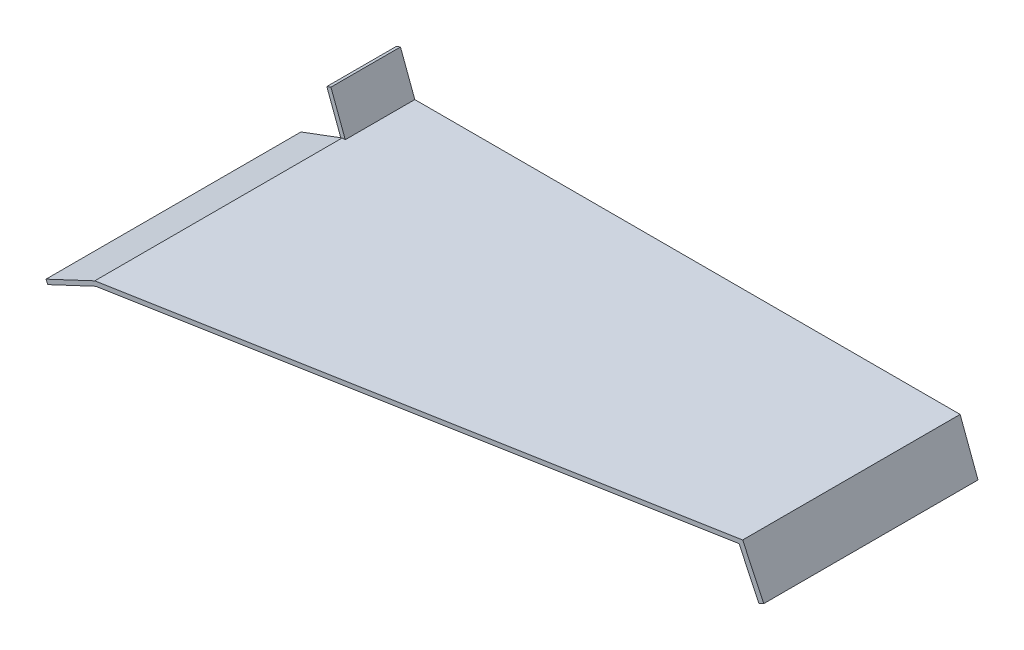
ISO-10303-21;
HEADER;
FILE_DESCRIPTION(('STEP AP214'),'2;1');
FILE_NAME('part.step','',(''),(''),'','','');
FILE_SCHEMA(('AUTOMOTIVE_DESIGN { 1 0 10303 214 1 1 1 1 }'));
ENDSEC;
DATA;
#1=APPLICATION_CONTEXT('core data for automotive mechanical design processes');
#2=APPLICATION_PROTOCOL_DEFINITION('international standard','automotive_design',2000,#1);
#3=PRODUCT_CONTEXT('',#1,'mechanical');
#4=PRODUCT('Part','Part','',(#3));
#5=PRODUCT_RELATED_PRODUCT_CATEGORY('part','',(#4));
#6=PRODUCT_DEFINITION_FORMATION('','',#4);
#7=PRODUCT_DEFINITION_CONTEXT('part definition',#1,'design');
#8=PRODUCT_DEFINITION('design','',#6,#7);
#9=PRODUCT_DEFINITION_SHAPE('','',#8);
#10=(LENGTH_UNIT() NAMED_UNIT(*) SI_UNIT(.MILLI.,.METRE.));
#11=(NAMED_UNIT(*) PLANE_ANGLE_UNIT() SI_UNIT($,.RADIAN.));
#12=(NAMED_UNIT(*) SI_UNIT($,.STERADIAN.) SOLID_ANGLE_UNIT());
#13=UNCERTAINTY_MEASURE_WITH_UNIT(LENGTH_MEASURE(1.E-05),#10,'distance_accuracy_value','');
#14=(GEOMETRIC_REPRESENTATION_CONTEXT(3) GLOBAL_UNCERTAINTY_ASSIGNED_CONTEXT((#13)) GLOBAL_UNIT_ASSIGNED_CONTEXT((#10,
#11,#12)) REPRESENTATION_CONTEXT('',''));
#15=CARTESIAN_POINT('',(0.,0.,0.));
#16=DIRECTION('',(0.,0.,1.));
#17=DIRECTION('',(1.,0.,0.));
#18=AXIS2_PLACEMENT_3D('',#15,#16,#17);
#19=CARTESIAN_POINT('',(0.,0.,0.));
#20=DIRECTION('',(0.,-1.,0.));
#21=DIRECTION('',(0.,0.,-1.));
#22=AXIS2_PLACEMENT_3D('',#19,#20,#21);
#23=PLANE('',#22);
#24=DIRECTION('',(0.,0.,-1.));
#25=VECTOR('',#24,1.);
#26=CARTESIAN_POINT('',(0.573561283399611,0.,0.));
#27=LINE('',#26,#25);
#28=CARTESIAN_POINT('',(0.573561283399616,0.,-0.10414342733818));
#29=VERTEX_POINT('',#28);
#30=CARTESIAN_POINT('',(0.573561283399613,0.,-178.435));
#31=VERTEX_POINT('',#30);
#32=EDGE_CURVE('E231',#29,#31,#27,.T.);
#33=ORIENTED_EDGE('',*,*,#32,.T.);
#34=DIRECTION('',(-1.,0.,0.));
#35=VECTOR('',#34,1.);
#36=CARTESIAN_POINT('',(0.,0.,-178.435));
#37=LINE('',#36,#35);
#38=CARTESIAN_POINT('',(0.,0.,-178.435));
#39=VERTEX_POINT('',#38);
#40=EDGE_CURVE('E225',#31,#39,#37,.T.);
#41=ORIENTED_EDGE('',*,*,#40,.T.);
#42=DIRECTION('',(0.,0.,1.));
#43=VECTOR('',#42,1.);
#44=CARTESIAN_POINT('',(0.,0.,0.));
#45=LINE('',#44,#43);
#46=CARTESIAN_POINT('',(0.,0.,-228.6));
#47=VERTEX_POINT('',#46);
#48=EDGE_CURVE('E206',#47,#39,#45,.T.);
#49=ORIENTED_EDGE('',*,*,#48,.F.);
#50=DIRECTION('',(-1.,0.,0.));
#51=VECTOR('',#50,1.);
#52=CARTESIAN_POINT('',(0.,0.,-228.6));
#53=LINE('',#52,#51);
#54=CARTESIAN_POINT('',(393.206531202999,0.,-228.6));
#55=VERTEX_POINT('',#54);
#56=EDGE_CURVE('E49',#55,#47,#53,.T.);
#57=ORIENTED_EDGE('',*,*,#56,.F.);
#58=DIRECTION('',(0.,0.,-1.));
#59=VECTOR('',#58,1.);
#60=CARTESIAN_POINT('',(393.206531202999,0.,0.));
#61=LINE('',#60,#59);
#62=CARTESIAN_POINT('',(393.206531202999,0.,-71.3958159248803));
#63=VERTEX_POINT('',#62);
#64=EDGE_CURVE('E197',#63,#55,#61,.T.);
#65=ORIENTED_EDGE('',*,*,#64,.F.);
#66=DIRECTION('',(-0.983912284561168,0.,0.178652221619614));
#67=VECTOR('',#66,1.);
#68=CARTESIAN_POINT('',(0.,0.,0.));
#69=LINE('',#68,#67);
#70=EDGE_CURVE('E202',#63,#29,#69,.T.);
#71=ORIENTED_EDGE('',*,*,#70,.T.);
#72=EDGE_LOOP('',(#33,#41,#49,#57,#65,#71));
#73=FACE_BOUND('',#72,.T.);
#74=ADVANCED_FACE('F45',(#73),#23,.T.);
#75=CARTESIAN_POINT('',(0.,0.,-178.435));
#76=DIRECTION('',(0.,0.,-1.));
#77=DIRECTION('',(-1.,0.,0.));
#78=AXIS2_PLACEMENT_3D('',#75,#76,#77);
#79=PLANE('',#78);
#80=DIRECTION('',(-0.936794377617936,-0.349880399655975,0.));
#81=VECTOR('',#80,1.);
#82=CARTESIAN_POINT('',(0.,3.175,-178.435));
#83=LINE('',#82,#81);
#84=CARTESIAN_POINT('',(0.,3.175,-178.435));
#85=VERTEX_POINT('',#84);
#86=CARTESIAN_POINT('',(-1.04065702217567,2.78632826634863,-178.435));
#87=VERTEX_POINT('',#86);
#88=EDGE_CURVE('E63',#85,#87,#83,.T.);
#89=ORIENTED_EDGE('',*,*,#88,.F.);
#90=DIRECTION('',(1.,0.,0.));
#91=VECTOR('',#90,1.);
#92=CARTESIAN_POINT('',(0.,3.175,-178.435));
#93=LINE('',#92,#91);
#94=CARTESIAN_POINT('',(2.20339679700138,3.175,-178.435));
#95=VERTEX_POINT('',#94);
#96=EDGE_CURVE('E149',#85,#95,#93,.T.);
#97=ORIENTED_EDGE('',*,*,#96,.T.);
#98=DIRECTION('',(0.349880399655972,-0.936794377617937,0.));
#99=VECTOR('',#98,1.);
#100=CARTESIAN_POINT('',(-8.13438054014019,30.8540917582772,-178.435));
#101=LINE('',#100,#99);
#102=CARTESIAN_POINT('',(-8.13438054014019,30.8540917582772,-178.435));
#103=VERTEX_POINT('',#102);
#104=EDGE_CURVE('E239',#103,#95,#101,.T.);
#105=ORIENTED_EDGE('',*,*,#104,.F.);
#106=DIRECTION('',(0.936794377617936,0.349880399655973,0.));
#107=VECTOR('',#106,1.);
#108=CARTESIAN_POINT('',(-11.1087026890771,29.7432214893695,-178.435));
#109=LINE('',#108,#107);
#110=CARTESIAN_POINT('',(-11.1087026890771,29.7432214893695,-178.435));
#111=VERTEX_POINT('',#110);
#112=EDGE_CURVE('E250',#111,#103,#109,.T.);
#113=ORIENTED_EDGE('',*,*,#112,.F.);
#114=DIRECTION('',(-0.349880399655973,0.936794377617936,0.));
#115=VECTOR('',#114,1.);
#116=CARTESIAN_POINT('',(0.,0.,-178.435));
#117=LINE('',#116,#115);
#118=EDGE_CURVE('E152',#87,#111,#117,.T.);
#119=ORIENTED_EDGE('',*,*,#118,.F.);
#120=EDGE_LOOP('',(#89,#97,#105,#113,#119));
#121=FACE_BOUND('',#120,.T.);
#122=ADVANCED_FACE('F147',(#121),#79,.F.);
#123=CARTESIAN_POINT('',(0.,3.175,-228.6));
#124=DIRECTION('',(0.,0.,1.));
#125=DIRECTION('',(1.,0.,0.));
#126=AXIS2_PLACEMENT_3D('',#123,#124,#125);
#127=PLANE('',#126);
#128=ORIENTED_EDGE('',*,*,#56,.T.);
#129=DIRECTION('',(-0.349880399655973,0.936794377617936,0.));
#130=VECTOR('',#129,1.);
#131=CARTESIAN_POINT('',(0.,0.,-228.6));
#132=LINE('',#131,#130);
#133=CARTESIAN_POINT('',(-11.1087026890771,29.7432214893695,-228.6));
#134=VERTEX_POINT('',#133);
#135=EDGE_CURVE('E219',#47,#134,#132,.T.);
#136=ORIENTED_EDGE('',*,*,#135,.T.);
#137=DIRECTION('',(0.936794377617936,0.349880399655973,0.));
#138=VECTOR('',#137,1.);
#139=CARTESIAN_POINT('',(-11.1087026890771,29.7432214893695,-228.6));
#140=LINE('',#139,#138);
#141=CARTESIAN_POINT('',(-8.13438054014019,30.8540917582772,-228.6));
#142=VERTEX_POINT('',#141);
#143=EDGE_CURVE('E230',#134,#142,#140,.T.);
#144=ORIENTED_EDGE('',*,*,#143,.T.);
#145=DIRECTION('',(0.349880399655972,-0.936794377617937,0.));
#146=VECTOR('',#145,1.);
#147=CARTESIAN_POINT('',(-8.13438054014019,30.8540917582772,-228.6));
#148=LINE('',#147,#146);
#149=CARTESIAN_POINT('',(2.20339679700138,3.175,-228.6));
#150=VERTEX_POINT('',#149);
#151=EDGE_CURVE('E235',#142,#150,#148,.T.);
#152=ORIENTED_EDGE('',*,*,#151,.T.);
#153=DIRECTION('',(-1.,0.,0.));
#154=VECTOR('',#153,1.);
#155=CARTESIAN_POINT('',(0.,3.175,-228.6));
#156=LINE('',#155,#154);
#157=CARTESIAN_POINT('',(395.409928,3.175,-228.6));
#158=VERTEX_POINT('',#157);
#159=EDGE_CURVE('E11',#158,#150,#156,.T.);
#160=ORIENTED_EDGE('',*,*,#159,.F.);
#161=DIRECTION('',(0.349880399655967,-0.936794377617939,0.));
#162=VECTOR('',#161,1.);
#163=CARTESIAN_POINT('',(395.409928,3.175,-228.6));
#164=LINE('',#163,#162);
#165=CARTESIAN_POINT('',(408.296023119329,-31.3271369276687,-228.6));
#166=VERTEX_POINT('',#165);
#167=EDGE_CURVE('E164',#158,#166,#164,.T.);
#168=ORIENTED_EDGE('',*,*,#167,.T.);
#169=DIRECTION('',(-0.936794377617938,-0.349880399655968,0.));
#170=VECTOR('',#169,1.);
#171=CARTESIAN_POINT('',(408.296023119329,-31.3271369276687,-228.6));
#172=LINE('',#171,#170);
#173=CARTESIAN_POINT('',(405.321700970392,-32.4380071965764,-228.6));
#174=VERTEX_POINT('',#173);
#175=EDGE_CURVE('E181',#166,#174,#172,.T.);
#176=ORIENTED_EDGE('',*,*,#175,.T.);
#177=DIRECTION('',(-0.349880399655965,0.936794377617939,0.));
#178=VECTOR('',#177,1.);
#179=CARTESIAN_POINT('',(405.321700970392,-32.4380071965764,-228.6));
#180=LINE('',#179,#178);
#181=EDGE_CURVE('E185',#174,#55,#180,.T.);
#182=ORIENTED_EDGE('',*,*,#181,.T.);
#183=EDGE_LOOP('',(#128,#136,#144,#152,#160,#168,#176,#182));
#184=FACE_BOUND('',#183,.T.);
#185=ADVANCED_FACE('F47',(#184),#127,.F.);
#186=CARTESIAN_POINT('',(0.,3.175,0.));
#187=DIRECTION('',(0.,-1.,0.));
#188=DIRECTION('',(0.,0.,-1.));
#189=AXIS2_PLACEMENT_3D('',#186,#187,#188);
#190=PLANE('',#189);
#191=DIRECTION('',(0.,0.,1.));
#192=VECTOR('',#191,1.);
#193=CARTESIAN_POINT('',(2.20339679700138,3.175,0.));
#194=LINE('',#193,#192);
#195=EDGE_CURVE('E70',#150,#95,#194,.T.);
#196=ORIENTED_EDGE('',*,*,#195,.T.);
#197=ORIENTED_EDGE('',*,*,#96,.F.);
#198=DIRECTION('',(0.,0.,1.));
#199=VECTOR('',#198,1.);
#200=CARTESIAN_POINT('',(0.,3.175,0.));
#201=LINE('',#200,#199);
#202=CARTESIAN_POINT('',(0.,3.175,0.));
#203=VERTEX_POINT('',#202);
#204=EDGE_CURVE('E139',#85,#203,#201,.T.);
#205=ORIENTED_EDGE('',*,*,#204,.T.);
#206=DIRECTION('',(-0.983912284561168,0.,0.178652221619614));
#207=VECTOR('',#206,1.);
#208=CARTESIAN_POINT('',(0.,3.175,0.));
#209=LINE('',#208,#207);
#210=CARTESIAN_POINT('',(395.409928,3.175,-71.795894));
#211=VERTEX_POINT('',#210);
#212=EDGE_CURVE('E201',#211,#203,#209,.T.);
#213=ORIENTED_EDGE('',*,*,#212,.F.);
#214=DIRECTION('',(0.,0.,-1.));
#215=VECTOR('',#214,1.);
#216=CARTESIAN_POINT('',(395.409928,3.175,0.));
#217=LINE('',#216,#215);
#218=EDGE_CURVE('E55',#211,#158,#217,.T.);
#219=ORIENTED_EDGE('',*,*,#218,.T.);
#220=ORIENTED_EDGE('',*,*,#159,.T.);
#221=EDGE_LOOP('',(#196,#197,#205,#213,#219,#220));
#222=FACE_BOUND('',#221,.T.);
#223=ADVANCED_FACE('F158',(#222),#190,.F.);
#224=CARTESIAN_POINT('',(0.,0.,0.));
#225=DIRECTION('',(-0.178652221619614,0.,-0.983912284561168));
#226=DIRECTION('',(-0.983912284561168,0.,0.178652221619614));
#227=AXIS2_PLACEMENT_3D('',#224,#225,#226);
#228=PLANE('',#227);
#229=ORIENTED_EDGE('',*,*,#212,.T.);
#230=DIRECTION('',(0.923529429297362,0.344926115630894,-0.167688306024815));
#231=VECTOR('',#230,1.);
#232=CARTESIAN_POINT('',(-6.73779049224047,0.658523720309113,1.22340299957037));
#233=LINE('',#232,#231);
#234=CARTESIAN_POINT('',(-29.7432214893695,-7.93370268907719,5.40057551936149));
#235=VERTEX_POINT('',#234);
#236=EDGE_CURVE('E142',#235,#203,#233,.T.);
#237=ORIENTED_EDGE('',*,*,#236,.F.);
#238=DIRECTION('',(-0.349176483776397,0.934909663758704,0.063401133965718));
#239=VECTOR('',#238,1.);
#240=CARTESIAN_POINT('',(-30.5868393172274,-5.67494101287959,5.55375401048274));
#241=LINE('',#240,#239);
#242=CARTESIAN_POINT('',(-28.6323512204617,-10.9080248380141,5.19887111482704));
#243=VERTEX_POINT('',#242);
#244=EDGE_CURVE('E305',#243,#235,#241,.T.);
#245=ORIENTED_EDGE('',*,*,#244,.F.);
#246=DIRECTION('',(-0.923529429297362,-0.344926115630894,0.167688306024815));
#247=VECTOR('',#246,1.);
#248=CARTESIAN_POINT('',(-34.5650180926738,-13.1237980171332,6.27608514445215));
#249=LINE('',#248,#247);
#250=EDGE_CURVE('E315',#29,#243,#249,.T.);
#251=ORIENTED_EDGE('',*,*,#250,.F.);
#252=ORIENTED_EDGE('',*,*,#70,.F.);
#253=DIRECTION('',(0.349176483776387,-0.934909663758708,-0.0634011339657161));
#254=VECTOR('',#253,1.);
#255=CARTESIAN_POINT('',(404.427022124905,-30.0425311623353,-73.4331577309695));
#256=LINE('',#255,#254);
#257=CARTESIAN_POINT('',(405.321700970392,-32.4380071965764,-73.5956075406634));
#258=VERTEX_POINT('',#257);
#259=EDGE_CURVE('E173',#63,#258,#256,.T.);
#260=ORIENTED_EDGE('',*,*,#259,.T.);
#261=DIRECTION('',(0.923529429297365,0.344926115630887,-0.167688306024815));
#262=VECTOR('',#261,1.);
#263=CARTESIAN_POINT('',(401.953765777806,-33.6958867690328,-72.9840803609872));
#264=LINE('',#263,#262);
#265=CARTESIAN_POINT('',(408.296023119329,-31.3271369276687,-74.1356650925996));
#266=VERTEX_POINT('',#265);
#267=EDGE_CURVE('E170',#258,#266,#264,.T.);
#268=ORIENTED_EDGE('',*,*,#267,.T.);
#269=DIRECTION('',(-0.349176483776388,0.934909663758707,0.0634011339657165));
#270=VECTOR('',#269,1.);
#271=CARTESIAN_POINT('',(394.555091545869,5.46379921481912,-71.6406785056431));
#272=LINE('',#271,#270);
#273=EDGE_CURVE('E177',#266,#211,#272,.T.);
#274=ORIENTED_EDGE('',*,*,#273,.T.);
#275=EDGE_LOOP('',(#229,#237,#245,#251,#252,#260,#268,#274));
#276=FACE_BOUND('',#275,.T.);
#277=ADVANCED_FACE('F278',(#276),#228,.F.);
#278=CARTESIAN_POINT('',(405.321700970392,-32.4380071965764,-33.1822292780044));
#279=DIRECTION('',(-0.936794377617939,-0.349880399655965,0.));
#280=DIRECTION('',(0.349880399655965,-0.936794377617939,0.));
#281=AXIS2_PLACEMENT_3D('',#278,#279,#280);
#282=PLANE('',#281);
#283=ORIENTED_EDGE('',*,*,#259,.F.);
#284=ORIENTED_EDGE('',*,*,#64,.T.);
#285=ORIENTED_EDGE('',*,*,#181,.F.);
#286=DIRECTION('',(0.,0.,-1.));
#287=VECTOR('',#286,1.);
#288=CARTESIAN_POINT('',(405.321700970392,-32.4380071965764,-33.1822292780044));
#289=LINE('',#288,#287);
#290=EDGE_CURVE('E174',#258,#174,#289,.T.);
#291=ORIENTED_EDGE('',*,*,#290,.F.);
#292=EDGE_LOOP('',(#283,#284,#285,#291));
#293=FACE_BOUND('',#292,.T.);
#294=ADVANCED_FACE('F281',(#293),#282,.T.);
#295=CARTESIAN_POINT('',(408.296023119329,-31.3271369276687,-33.1822292780044));
#296=DIRECTION('',(0.349880399655968,-0.936794377617938,0.));
#297=DIRECTION('',(0.936794377617938,0.349880399655968,0.));
#298=AXIS2_PLACEMENT_3D('',#295,#296,#297);
#299=PLANE('',#298);
#300=ORIENTED_EDGE('',*,*,#267,.F.);
#301=ORIENTED_EDGE('',*,*,#290,.T.);
#302=ORIENTED_EDGE('',*,*,#175,.F.);
#303=DIRECTION('',(0.,0.,-1.));
#304=VECTOR('',#303,1.);
#305=CARTESIAN_POINT('',(408.296023119329,-31.3271369276687,-33.1822292780044));
#306=LINE('',#305,#304);
#307=EDGE_CURVE('E189',#266,#166,#306,.T.);
#308=ORIENTED_EDGE('',*,*,#307,.F.);
#309=EDGE_LOOP('',(#300,#301,#302,#308));
#310=FACE_BOUND('',#309,.T.);
#311=ADVANCED_FACE('F285',(#310),#299,.T.);
#312=CARTESIAN_POINT('',(395.409928,3.175,-33.1822292780044));
#313=DIRECTION('',(0.936794377617939,0.349880399655967,0.));
#314=DIRECTION('',(-0.349880399655967,0.936794377617939,0.));
#315=AXIS2_PLACEMENT_3D('',#312,#313,#314);
#316=PLANE('',#315);
#317=ORIENTED_EDGE('',*,*,#273,.F.);
#318=ORIENTED_EDGE('',*,*,#307,.T.);
#319=ORIENTED_EDGE('',*,*,#167,.F.);
#320=ORIENTED_EDGE('',*,*,#218,.F.);
#321=EDGE_LOOP('',(#317,#318,#319,#320));
#322=FACE_BOUND('',#321,.T.);
#323=ADVANCED_FACE('F269',(#322),#316,.T.);
#324=CARTESIAN_POINT('',(-8.13438054014019,30.8540917582772,-178.435));
#325=DIRECTION('',(0.936794377617937,0.349880399655972,0.));
#326=DIRECTION('',(-0.349880399655972,0.936794377617937,0.));
#327=AXIS2_PLACEMENT_3D('',#324,#325,#326);
#328=PLANE('',#327);
#329=ORIENTED_EDGE('',*,*,#195,.F.);
#330=ORIENTED_EDGE('',*,*,#151,.F.);
#331=DIRECTION('',(0.,0.,-1.));
#332=VECTOR('',#331,1.);
#333=CARTESIAN_POINT('',(-8.13438054014019,30.8540917582772,-178.435));
#334=LINE('',#333,#332);
#335=EDGE_CURVE('E160',#103,#142,#334,.T.);
#336=ORIENTED_EDGE('',*,*,#335,.F.);
#337=ORIENTED_EDGE('',*,*,#104,.T.);
#338=EDGE_LOOP('',(#329,#330,#336,#337));
#339=FACE_BOUND('',#338,.T.);
#340=ADVANCED_FACE('F258',(#339),#328,.T.);
#341=CARTESIAN_POINT('',(-11.1087026890771,29.7432214893695,-178.435));
#342=DIRECTION('',(-0.349880399655973,0.936794377617936,0.));
#343=DIRECTION('',(-0.936794377617936,-0.349880399655973,0.));
#344=AXIS2_PLACEMENT_3D('',#341,#342,#343);
#345=PLANE('',#344);
#346=ORIENTED_EDGE('',*,*,#143,.F.);
#347=DIRECTION('',(0.,0.,-1.));
#348=VECTOR('',#347,1.);
#349=CARTESIAN_POINT('',(-11.1087026890771,29.7432214893695,-178.435));
#350=LINE('',#349,#348);
#351=EDGE_CURVE('E166',#111,#134,#350,.T.);
#352=ORIENTED_EDGE('',*,*,#351,.F.);
#353=ORIENTED_EDGE('',*,*,#112,.T.);
#354=ORIENTED_EDGE('',*,*,#335,.T.);
#355=EDGE_LOOP('',(#346,#352,#353,#354));
#356=FACE_BOUND('',#355,.T.);
#357=ADVANCED_FACE('F259',(#356),#345,.T.);
#358=CARTESIAN_POINT('',(0.,0.,-178.435));
#359=DIRECTION('',(-0.936794377617936,-0.349880399655973,0.));
#360=DIRECTION('',(0.349880399655973,-0.936794377617936,0.));
#361=AXIS2_PLACEMENT_3D('',#358,#359,#360);
#362=PLANE('',#361);
#363=ORIENTED_EDGE('',*,*,#135,.F.);
#364=ORIENTED_EDGE('',*,*,#48,.T.);
#365=EDGE_CURVE('E247',#39,#87,#117,.T.);
#366=ORIENTED_EDGE('',*,*,#365,.T.);
#367=ORIENTED_EDGE('',*,*,#118,.T.);
#368=ORIENTED_EDGE('',*,*,#351,.T.);
#369=EDGE_LOOP('',(#363,#364,#366,#367,#368));
#370=FACE_BOUND('',#369,.T.);
#371=ADVANCED_FACE('F226',(#370),#362,.T.);
#372=CARTESIAN_POINT('',(0.,0.,-178.435));
#373=DIRECTION('',(0.,0.,1.));
#374=DIRECTION('',(1.,0.,0.));
#375=AXIS2_PLACEMENT_3D('',#372,#373,#374);
#376=PLANE('',#375);
#377=ORIENTED_EDGE('',*,*,#40,.F.);
#378=DIRECTION('',(0.936794377617936,0.349880399655975,0.));
#379=VECTOR('',#378,1.);
#380=CARTESIAN_POINT('',(-28.6323512204617,-10.9080248380141,-178.435));
#381=LINE('',#380,#379);
#382=CARTESIAN_POINT('',(-28.6323512204617,-10.9080248380141,-178.435));
#383=VERTEX_POINT('',#382);
#384=EDGE_CURVE('E326',#383,#31,#381,.T.);
#385=ORIENTED_EDGE('',*,*,#384,.F.);
#386=DIRECTION('',(0.349880399655976,-0.936794377617935,0.));
#387=VECTOR('',#386,1.);
#388=CARTESIAN_POINT('',(-29.7432214893695,-7.93370268907719,-178.435));
#389=LINE('',#388,#387);
#390=CARTESIAN_POINT('',(-29.7432214893695,-7.93370268907719,-178.435));
#391=VERTEX_POINT('',#390);
#392=EDGE_CURVE('E155',#391,#383,#389,.T.);
#393=ORIENTED_EDGE('',*,*,#392,.F.);
#394=EDGE_CURVE('E156',#87,#391,#83,.T.);
#395=ORIENTED_EDGE('',*,*,#394,.F.);
#396=ORIENTED_EDGE('',*,*,#365,.F.);
#397=EDGE_LOOP('',(#377,#385,#393,#395,#396));
#398=FACE_BOUND('',#397,.T.);
#399=ADVANCED_FACE('F267',(#398),#376,.F.);
#400=CARTESIAN_POINT('',(-28.6323512204617,-10.9080248380141,43.5074856785727));
#401=DIRECTION('',(-0.349880399655975,0.936794377617936,0.));
#402=DIRECTION('',(-0.936794377617936,-0.349880399655975,0.));
#403=AXIS2_PLACEMENT_3D('',#400,#401,#402);
#404=PLANE('',#403);
#405=ORIENTED_EDGE('',*,*,#32,.F.);
#406=ORIENTED_EDGE('',*,*,#250,.T.);
#407=DIRECTION('',(0.,0.,-1.));
#408=VECTOR('',#407,1.);
#409=CARTESIAN_POINT('',(-28.6323512204617,-10.9080248380141,43.5074856785727));
#410=LINE('',#409,#408);
#411=EDGE_CURVE('E316',#243,#383,#410,.T.);
#412=ORIENTED_EDGE('',*,*,#411,.T.);
#413=ORIENTED_EDGE('',*,*,#384,.T.);
#414=EDGE_LOOP('',(#405,#406,#412,#413));
#415=FACE_BOUND('',#414,.T.);
#416=ADVANCED_FACE('F333',(#415),#404,.F.);
#417=CARTESIAN_POINT('',(-29.7432214893695,-7.93370268907719,43.5074856785727));
#418=DIRECTION('',(0.936794377617935,0.349880399655976,0.));
#419=DIRECTION('',(-0.349880399655976,0.936794377617935,0.));
#420=AXIS2_PLACEMENT_3D('',#417,#418,#419);
#421=PLANE('',#420);
#422=ORIENTED_EDGE('',*,*,#411,.F.);
#423=ORIENTED_EDGE('',*,*,#244,.T.);
#424=DIRECTION('',(0.,0.,-1.));
#425=VECTOR('',#424,1.);
#426=CARTESIAN_POINT('',(-29.7432214893695,-7.93370268907719,43.5074856785727));
#427=LINE('',#426,#425);
#428=EDGE_CURVE('E310',#235,#391,#427,.T.);
#429=ORIENTED_EDGE('',*,*,#428,.T.);
#430=ORIENTED_EDGE('',*,*,#392,.T.);
#431=EDGE_LOOP('',(#422,#423,#429,#430));
#432=FACE_BOUND('',#431,.T.);
#433=ADVANCED_FACE('F318',(#432),#421,.F.);
#434=CARTESIAN_POINT('',(0.,3.175,43.5074856785727));
#435=DIRECTION('',(0.349880399655975,-0.936794377617936,0.));
#436=DIRECTION('',(0.936794377617936,0.349880399655975,0.));
#437=AXIS2_PLACEMENT_3D('',#434,#435,#436);
#438=PLANE('',#437);
#439=ORIENTED_EDGE('',*,*,#428,.F.);
#440=ORIENTED_EDGE('',*,*,#236,.T.);
#441=ORIENTED_EDGE('',*,*,#204,.F.);
#442=ORIENTED_EDGE('',*,*,#88,.T.);
#443=ORIENTED_EDGE('',*,*,#394,.T.);
#444=EDGE_LOOP('',(#439,#440,#441,#442,#443));
#445=FACE_BOUND('',#444,.T.);
#446=ADVANCED_FACE('F141',(#445),#438,.F.);
#447=CLOSED_SHELL('',(#74,#122,#185,#223,#277,#294,#311,#323,#340,#357,#371,#399,#416,#433,#446));
#448=MANIFOLD_SOLID_BREP('B2',#447);
#449=ADVANCED_BREP_SHAPE_REPRESENTATION('',(#18,#448),#14);
#450=SHAPE_DEFINITION_REPRESENTATION(#9,#449);
ENDSEC;
END-ISO-10303-21;
